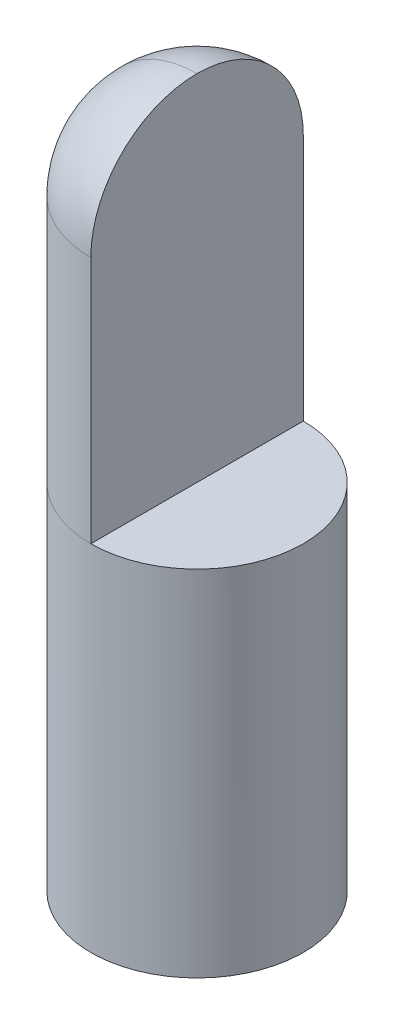
ISO-10303-21;
HEADER;
FILE_DESCRIPTION(('STEP AP214'),'2;1');
FILE_NAME('part.step','',(''),(''),'','','');
FILE_SCHEMA(('AUTOMOTIVE_DESIGN { 1 0 10303 214 1 1 1 1 }'));
ENDSEC;
DATA;
#1=APPLICATION_CONTEXT('core data for automotive mechanical design processes');
#2=APPLICATION_PROTOCOL_DEFINITION('international standard','automotive_design',2000,#1);
#3=PRODUCT_CONTEXT('',#1,'mechanical');
#4=PRODUCT('Part','Part','',(#3));
#5=PRODUCT_RELATED_PRODUCT_CATEGORY('part','',(#4));
#6=PRODUCT_DEFINITION_FORMATION('','',#4);
#7=PRODUCT_DEFINITION_CONTEXT('part definition',#1,'design');
#8=PRODUCT_DEFINITION('design','',#6,#7);
#9=PRODUCT_DEFINITION_SHAPE('','',#8);
#10=(LENGTH_UNIT() NAMED_UNIT(*) SI_UNIT(.MILLI.,.METRE.));
#11=(NAMED_UNIT(*) PLANE_ANGLE_UNIT() SI_UNIT($,.RADIAN.));
#12=(NAMED_UNIT(*) SI_UNIT($,.STERADIAN.) SOLID_ANGLE_UNIT());
#13=UNCERTAINTY_MEASURE_WITH_UNIT(LENGTH_MEASURE(1.E-05),#10,'distance_accuracy_value','');
#14=(GEOMETRIC_REPRESENTATION_CONTEXT(3) GLOBAL_UNCERTAINTY_ASSIGNED_CONTEXT((#13)) GLOBAL_UNIT_ASSIGNED_CONTEXT((#10,
#11,#12)) REPRESENTATION_CONTEXT('',''));
#15=CARTESIAN_POINT('',(0.,0.,0.));
#16=DIRECTION('',(0.,0.,1.));
#17=DIRECTION('',(1.,0.,0.));
#18=AXIS2_PLACEMENT_3D('',#15,#16,#17);
#19=CARTESIAN_POINT('',(0.,100.,0.));
#20=DIRECTION('',(0.,-1.,0.));
#21=DIRECTION('',(0.,0.,-1.));
#22=AXIS2_PLACEMENT_3D('',#19,#20,#21);
#23=PLANE('',#22);
#24=DIRECTION('',(0.,0.,-1.));
#25=VECTOR('',#24,1.);
#26=CARTESIAN_POINT('',(0.,100.,30.));
#27=LINE('',#26,#25);
#28=CARTESIAN_POINT('',(0.,100.,30.));
#29=VERTEX_POINT('',#28);
#30=CARTESIAN_POINT('',(0.,100.,-30.));
#31=VERTEX_POINT('',#30);
#32=EDGE_CURVE('E88',#29,#31,#27,.T.);
#33=ORIENTED_EDGE('',*,*,#32,.F.);
#34=CARTESIAN_POINT('',(0.,100.,0.));
#35=DIRECTION('',(0.,-1.,0.));
#36=DIRECTION('',(0.,0.,-1.));
#37=AXIS2_PLACEMENT_3D('',#34,#35,#36);
#38=CIRCLE('',#37,30.);
#39=EDGE_CURVE('E73',#31,#29,#38,.T.);
#40=ORIENTED_EDGE('',*,*,#39,.F.);
#41=EDGE_LOOP('',(#33,#40));
#42=FACE_BOUND('',#41,.T.);
#43=ADVANCED_FACE('F39',(#42),#23,.F.);
#44=CARTESIAN_POINT('',(0.,0.,0.));
#45=DIRECTION('',(0.,-1.,0.));
#46=DIRECTION('',(0.,0.,-1.));
#47=AXIS2_PLACEMENT_3D('',#44,#45,#46);
#48=CYLINDRICAL_SURFACE('',#47,30.);
#49=CARTESIAN_POINT('',(0.,0.,0.));
#50=DIRECTION('',(0.,-1.,0.));
#51=DIRECTION('',(0.,0.,-1.));
#52=AXIS2_PLACEMENT_3D('',#49,#50,#51);
#53=CIRCLE('',#52,30.);
#54=CARTESIAN_POINT('',(0.,0.,-30.));
#55=VERTEX_POINT('',#54);
#56=EDGE_CURVE('E112',#55,#55,#53,.T.);
#57=ORIENTED_EDGE('',*,*,#56,.F.);
#58=EDGE_LOOP('',(#57));
#59=FACE_BOUND('',#58,.T.);
#60=ORIENTED_EDGE('',*,*,#39,.T.);
#61=CARTESIAN_POINT('',(-30.,100.,0.));
#62=VERTEX_POINT('',#61);
#63=EDGE_CURVE('E111',#29,#62,#38,.T.);
#64=ORIENTED_EDGE('',*,*,#63,.T.);
#65=EDGE_CURVE('E83',#62,#31,#38,.T.);
#66=ORIENTED_EDGE('',*,*,#65,.T.);
#67=EDGE_LOOP('',(#60,#64,#66));
#68=FACE_BOUND('',#67,.T.);
#69=ADVANCED_FACE('F125',(#59,#68),#48,.T.);
#70=CARTESIAN_POINT('',(0.,0.,0.));
#71=DIRECTION('',(0.,1.,0.));
#72=DIRECTION('',(0.,0.,1.));
#73=AXIS2_PLACEMENT_3D('',#70,#71,#72);
#74=PLANE('',#73);
#75=ORIENTED_EDGE('',*,*,#56,.T.);
#76=EDGE_LOOP('',(#75));
#77=FACE_BOUND('',#76,.T.);
#78=ADVANCED_FACE('F129',(#77),#74,.F.);
#79=CARTESIAN_POINT('',(0.,200.,30.));
#80=DIRECTION('',(-1.,0.,0.));
#81=DIRECTION('',(0.,0.,1.));
#82=AXIS2_PLACEMENT_3D('',#79,#80,#81);
#83=PLANE('',#82);
#84=DIRECTION('',(0.,-1.,0.));
#85=VECTOR('',#84,1.);
#86=CARTESIAN_POINT('',(0.,200.,-30.));
#87=LINE('',#86,#85);
#88=CARTESIAN_POINT('',(0.,170.,-30.));
#89=VERTEX_POINT('',#88);
#90=EDGE_CURVE('E116',#89,#31,#87,.T.);
#91=ORIENTED_EDGE('',*,*,#90,.F.);
#92=CARTESIAN_POINT('',(0.,170.,0.));
#93=DIRECTION('',(-1.,0.,0.));
#94=DIRECTION('',(0.,0.,1.));
#95=AXIS2_PLACEMENT_3D('',#92,#93,#94);
#96=CIRCLE('',#95,30.);
#97=CARTESIAN_POINT('',(0.,200.,0.));
#98=VERTEX_POINT('',#97);
#99=EDGE_CURVE('E11',#89,#98,#96,.F.);
#100=ORIENTED_EDGE('',*,*,#99,.T.);
#101=CARTESIAN_POINT('',(0.,170.,0.));
#102=DIRECTION('',(-1.,0.,0.));
#103=DIRECTION('',(0.,0.,1.));
#104=AXIS2_PLACEMENT_3D('',#101,#102,#103);
#105=CIRCLE('',#104,30.);
#106=CARTESIAN_POINT('',(0.,170.,30.));
#107=VERTEX_POINT('',#106);
#108=EDGE_CURVE('E50',#98,#107,#105,.F.);
#109=ORIENTED_EDGE('',*,*,#108,.T.);
#110=DIRECTION('',(0.,-1.,0.));
#111=VECTOR('',#110,1.);
#112=CARTESIAN_POINT('',(0.,200.,30.));
#113=LINE('',#112,#111);
#114=EDGE_CURVE('E99',#107,#29,#113,.T.);
#115=ORIENTED_EDGE('',*,*,#114,.T.);
#116=ORIENTED_EDGE('',*,*,#32,.T.);
#117=EDGE_LOOP('',(#91,#100,#109,#115,#116));
#118=FACE_BOUND('',#117,.T.);
#119=ADVANCED_FACE('F123',(#118),#83,.F.);
#120=CARTESIAN_POINT('',(0.,200.,0.));
#121=DIRECTION('',(0.,-1.,0.));
#122=DIRECTION('',(0.,0.,-1.));
#123=AXIS2_PLACEMENT_3D('',#120,#121,#122);
#124=CYLINDRICAL_SURFACE('',#123,30.);
#125=ORIENTED_EDGE('',*,*,#90,.T.);
#126=ORIENTED_EDGE('',*,*,#65,.F.);
#127=DIRECTION('',(0.,-1.,0.));
#128=VECTOR('',#127,1.);
#129=CARTESIAN_POINT('',(-30.,200.,0.));
#130=LINE('',#129,#128);
#131=CARTESIAN_POINT('',(-30.,170.,0.));
#132=VERTEX_POINT('',#131);
#133=EDGE_CURVE('E43',#132,#62,#130,.T.);
#134=ORIENTED_EDGE('',*,*,#133,.F.);
#135=CARTESIAN_POINT('',(0.,170.,0.));
#136=DIRECTION('',(0.,1.,0.));
#137=DIRECTION('',(0.,0.,1.));
#138=AXIS2_PLACEMENT_3D('',#135,#136,#137);
#139=CIRCLE('',#138,30.);
#140=EDGE_CURVE('E82',#89,#132,#139,.T.);
#141=ORIENTED_EDGE('',*,*,#140,.F.);
#142=EDGE_LOOP('',(#125,#126,#134,#141));
#143=FACE_BOUND('',#142,.T.);
#144=ADVANCED_FACE('F41',(#143),#124,.T.);
#145=CARTESIAN_POINT('',(0.,200.,0.));
#146=DIRECTION('',(0.,-1.,0.));
#147=DIRECTION('',(0.,0.,-1.));
#148=AXIS2_PLACEMENT_3D('',#145,#146,#147);
#149=CYLINDRICAL_SURFACE('',#148,30.);
#150=ORIENTED_EDGE('',*,*,#63,.F.);
#151=ORIENTED_EDGE('',*,*,#114,.F.);
#152=CARTESIAN_POINT('',(0.,170.,0.));
#153=DIRECTION('',(0.,1.,0.));
#154=DIRECTION('',(0.,0.,1.));
#155=AXIS2_PLACEMENT_3D('',#152,#153,#154);
#156=CIRCLE('',#155,30.);
#157=EDGE_CURVE('E95',#132,#107,#156,.T.);
#158=ORIENTED_EDGE('',*,*,#157,.F.);
#159=ORIENTED_EDGE('',*,*,#133,.T.);
#160=EDGE_LOOP('',(#150,#151,#158,#159));
#161=FACE_BOUND('',#160,.T.);
#162=ADVANCED_FACE('F98',(#161),#149,.T.);
#163=CARTESIAN_POINT('',(0.,170.,0.));
#164=DIRECTION('',(0.,0.,1.));
#165=DIRECTION('',(1.,0.,0.));
#166=AXIS2_PLACEMENT_3D('',#163,#164,#165);
#167=SPHERICAL_SURFACE('',#166,30.);
#168=ORIENTED_EDGE('',*,*,#99,.F.);
#169=ORIENTED_EDGE('',*,*,#140,.T.);
#170=CARTESIAN_POINT('',(0.,170.,0.));
#171=DIRECTION('',(0.,0.,-1.));
#172=DIRECTION('',(0.,1.,0.));
#173=AXIS2_PLACEMENT_3D('',#170,#171,#172);
#174=CIRCLE('',#173,30.);
#175=EDGE_CURVE('E93',#98,#132,#174,.F.);
#176=ORIENTED_EDGE('',*,*,#175,.F.);
#177=EDGE_LOOP('',(#168,#169,#176));
#178=FACE_BOUND('',#177,.T.);
#179=ADVANCED_FACE('F91',(#178),#167,.T.);
#180=CARTESIAN_POINT('',(0.,170.,0.));
#181=DIRECTION('',(0.,0.,1.));
#182=DIRECTION('',(1.,0.,0.));
#183=AXIS2_PLACEMENT_3D('',#180,#181,#182);
#184=SPHERICAL_SURFACE('',#183,30.);
#185=ORIENTED_EDGE('',*,*,#157,.T.);
#186=ORIENTED_EDGE('',*,*,#108,.F.);
#187=ORIENTED_EDGE('',*,*,#175,.T.);
#188=EDGE_LOOP('',(#185,#186,#187));
#189=FACE_BOUND('',#188,.T.);
#190=ADVANCED_FACE('F103',(#189),#184,.T.);
#191=CLOSED_SHELL('',(#43,#69,#78,#119,#144,#162,#179,#190));
#192=MANIFOLD_SOLID_BREP('B2',#191);
#193=ADVANCED_BREP_SHAPE_REPRESENTATION('',(#18,#192),#14);
#194=SHAPE_DEFINITION_REPRESENTATION(#9,#193);
ENDSEC;
END-ISO-10303-21;
